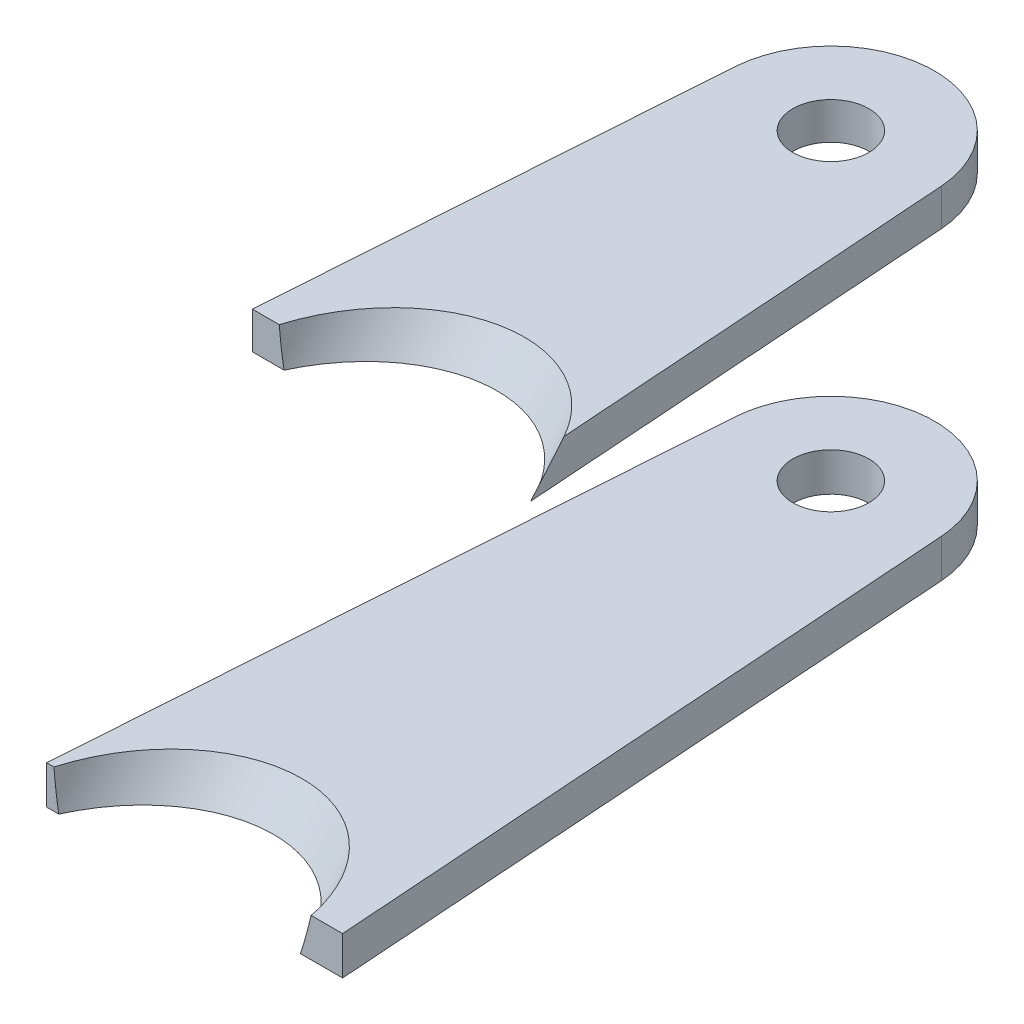
ISO-10303-21;
HEADER;
FILE_DESCRIPTION(('STEP AP214'),'2;1');
FILE_NAME('part.step','',(''),(''),'','','');
FILE_SCHEMA(('AUTOMOTIVE_DESIGN { 1 0 10303 214 1 1 1 1 }'));
ENDSEC;
DATA;
#1=APPLICATION_CONTEXT('core data for automotive mechanical design processes');
#2=APPLICATION_PROTOCOL_DEFINITION('international standard','automotive_design',2000,#1);
#3=PRODUCT_CONTEXT('',#1,'mechanical');
#4=PRODUCT('Part','Part','',(#3));
#5=PRODUCT_RELATED_PRODUCT_CATEGORY('part','',(#4));
#6=PRODUCT_DEFINITION_FORMATION('','',#4);
#7=PRODUCT_DEFINITION_CONTEXT('part definition',#1,'design');
#8=PRODUCT_DEFINITION('design','',#6,#7);
#9=PRODUCT_DEFINITION_SHAPE('','',#8);
#10=(LENGTH_UNIT() NAMED_UNIT(*) SI_UNIT(.MILLI.,.METRE.));
#11=(NAMED_UNIT(*) PLANE_ANGLE_UNIT() SI_UNIT($,.RADIAN.));
#12=(NAMED_UNIT(*) SI_UNIT($,.STERADIAN.) SOLID_ANGLE_UNIT());
#13=UNCERTAINTY_MEASURE_WITH_UNIT(LENGTH_MEASURE(1.E-05),#10,'distance_accuracy_value','');
#14=(GEOMETRIC_REPRESENTATION_CONTEXT(3) GLOBAL_UNCERTAINTY_ASSIGNED_CONTEXT((#13)) GLOBAL_UNIT_ASSIGNED_CONTEXT((#10,
#11,#12)) REPRESENTATION_CONTEXT('',''));
#15=CARTESIAN_POINT('',(0.,0.,0.));
#16=DIRECTION('',(0.,0.,1.));
#17=DIRECTION('',(1.,0.,0.));
#18=AXIS2_PLACEMENT_3D('',#15,#16,#17);
#19=CARTESIAN_POINT('',(-8.86868290993993,14.605,-0.615275095334869));
#20=DIRECTION('',(-0.997602127102355,0.,-0.0692097970005477));
#21=DIRECTION('',(0.0692097970005477,0.,-0.997602127102355));
#22=AXIS2_PLACEMENT_3D('',#19,#20,#21);
#23=PLANE('',#22);
#24=DIRECTION('',(-0.0692097970005477,0.,0.997602127102355));
#25=VECTOR('',#24,1.);
#26=CARTESIAN_POINT('',(-8.86868290993993,11.43,-0.615275095334869));
#27=LINE('',#26,#25);
#28=CARTESIAN_POINT('',(-8.86868290993993,11.43,-0.615275095334868));
#29=VERTEX_POINT('',#28);
#30=CARTESIAN_POINT('',(-11.55459972725,11.43,38.1));
#31=VERTEX_POINT('',#30);
#32=EDGE_CURVE('E118',#29,#31,#27,.T.);
#33=ORIENTED_EDGE('',*,*,#32,.T.);
#34=DIRECTION('',(0.,-1.,0.));
#35=VECTOR('',#34,1.);
#36=CARTESIAN_POINT('',(-11.55459972725,14.605,38.1));
#37=LINE('',#36,#35);
#38=CARTESIAN_POINT('',(-11.55459972725,14.605,38.1));
#39=VERTEX_POINT('',#38);
#40=EDGE_CURVE('E115',#39,#31,#37,.T.);
#41=ORIENTED_EDGE('',*,*,#40,.F.);
#42=DIRECTION('',(-0.0692097970005477,0.,0.997602127102355));
#43=VECTOR('',#42,1.);
#44=CARTESIAN_POINT('',(-8.86868290993993,14.605,-0.615275095334869));
#45=LINE('',#44,#43);
#46=CARTESIAN_POINT('',(-8.86868290993993,14.605,-0.615275095334868));
#47=VERTEX_POINT('',#46);
#48=EDGE_CURVE('E135',#47,#39,#45,.T.);
#49=ORIENTED_EDGE('',*,*,#48,.F.);
#50=DIRECTION('',(0.,-1.,0.));
#51=VECTOR('',#50,1.);
#52=CARTESIAN_POINT('',(-8.86868290993993,14.605,-0.615275095334868));
#53=LINE('',#52,#51);
#54=EDGE_CURVE('E141',#47,#29,#53,.T.);
#55=ORIENTED_EDGE('',*,*,#54,.T.);
#56=EDGE_LOOP('',(#33,#41,#49,#55));
#57=FACE_BOUND('',#56,.T.);
#58=ADVANCED_FACE('F53',(#57),#23,.T.);
#59=CARTESIAN_POINT('',(0.,14.605,0.));
#60=DIRECTION('',(0.,-1.,0.));
#61=DIRECTION('',(0.,0.,1.));
#62=AXIS2_PLACEMENT_3D('',#59,#60,#61);
#63=CYLINDRICAL_SURFACE('',#62,8.89);
#64=CARTESIAN_POINT('',(0.,11.43,0.));
#65=DIRECTION('',(0.,-1.,0.));
#66=DIRECTION('',(0.,0.,-1.));
#67=AXIS2_PLACEMENT_3D('',#64,#65,#66);
#68=CIRCLE('',#67,8.89);
#69=CARTESIAN_POINT('',(8.86868290993993,11.43,-0.615275095334868));
#70=VERTEX_POINT('',#69);
#71=EDGE_CURVE('E129',#29,#70,#68,.T.);
#72=ORIENTED_EDGE('',*,*,#71,.F.);
#73=ORIENTED_EDGE('',*,*,#54,.F.);
#74=CARTESIAN_POINT('',(0.,14.605,0.));
#75=DIRECTION('',(0.,-1.,0.));
#76=DIRECTION('',(0.,0.,-1.));
#77=AXIS2_PLACEMENT_3D('',#74,#75,#76);
#78=CIRCLE('',#77,8.89);
#79=CARTESIAN_POINT('',(8.86868290993993,14.605,-0.615275095334868));
#80=VERTEX_POINT('',#79);
#81=EDGE_CURVE('E121',#47,#80,#78,.T.);
#82=ORIENTED_EDGE('',*,*,#81,.T.);
#83=DIRECTION('',(0.,-1.,0.));
#84=VECTOR('',#83,1.);
#85=CARTESIAN_POINT('',(8.86868290993993,14.605,-0.615275095334868));
#86=LINE('',#85,#84);
#87=EDGE_CURVE('E139',#80,#70,#86,.T.);
#88=ORIENTED_EDGE('',*,*,#87,.T.);
#89=EDGE_LOOP('',(#72,#73,#82,#88));
#90=FACE_BOUND('',#89,.T.);
#91=ADVANCED_FACE('F148',(#90),#63,.T.);
#92=CARTESIAN_POINT('',(8.86868290993993,14.605,-0.615275095334869));
#93=DIRECTION('',(-0.997602127102355,0.,0.0692097970005477));
#94=DIRECTION('',(-0.0692097970005477,0.,-0.997602127102355));
#95=AXIS2_PLACEMENT_3D('',#92,#93,#94);
#96=PLANE('',#95);
#97=CARTESIAN_POINT('',(8.84283889499851,83.1664793631328,-0.987795249934129));
#98=DIRECTION('',(0.997602127102355,0.,-0.0692097970005477));
#99=DIRECTION('',(0.0363868695531692,-0.850640753053232,0.524486706189157));
#100=AXIS2_PLACEMENT_3D('',#97,#98,#99);
#101=ELLIPSE('',#100,90.6261498335669,11.43);
#102=CARTESIAN_POINT('',(11.2828227595914,14.605,34.1825592216163));
#103=VERTEX_POINT('',#102);
#104=CARTESIAN_POINT('',(11.4983302677009,11.43,37.2889221617482));
#105=VERTEX_POINT('',#104);
#106=EDGE_CURVE('E63',#103,#105,#101,.F.);
#107=ORIENTED_EDGE('',*,*,#106,.T.);
#108=DIRECTION('',(0.0692097970005477,0.,0.997602127102355));
#109=VECTOR('',#108,1.);
#110=CARTESIAN_POINT('',(8.86868290993993,11.43,-0.615275095334869));
#111=LINE('',#110,#109);
#112=EDGE_CURVE('E105',#70,#105,#111,.T.);
#113=ORIENTED_EDGE('',*,*,#112,.F.);
#114=ORIENTED_EDGE('',*,*,#87,.F.);
#115=DIRECTION('',(0.0692097970005477,0.,0.997602127102355));
#116=VECTOR('',#115,1.);
#117=CARTESIAN_POINT('',(8.86868290993993,14.605,-0.615275095334869));
#118=LINE('',#117,#116);
#119=EDGE_CURVE('E133',#80,#103,#118,.T.);
#120=ORIENTED_EDGE('',*,*,#119,.T.);
#121=EDGE_LOOP('',(#107,#113,#114,#120));
#122=FACE_BOUND('',#121,.T.);
#123=ADVANCED_FACE('F151',(#122),#96,.F.);
#124=CARTESIAN_POINT('',(0.,14.605,38.1));
#125=DIRECTION('',(0.,0.,1.));
#126=DIRECTION('',(-1.,0.,0.));
#127=AXIS2_PLACEMENT_3D('',#124,#125,#126);
#128=PLANE('',#127);
#129=DIRECTION('',(1.,0.,0.));
#130=VECTOR('',#129,1.);
#131=CARTESIAN_POINT('',(0.,14.605,38.1));
#132=LINE('',#131,#130);
#133=CARTESIAN_POINT('',(-9.24827472327813,14.605,38.1));
#134=VERTEX_POINT('',#133);
#135=EDGE_CURVE('E112',#39,#134,#132,.T.);
#136=ORIENTED_EDGE('',*,*,#135,.F.);
#137=ORIENTED_EDGE('',*,*,#40,.T.);
#138=DIRECTION('',(1.,0.,0.));
#139=VECTOR('',#138,1.);
#140=CARTESIAN_POINT('',(0.,11.43,38.1));
#141=LINE('',#140,#139);
#142=CARTESIAN_POINT('',(-8.82962589414889,11.43,38.1));
#143=VERTEX_POINT('',#142);
#144=EDGE_CURVE('E57',#31,#143,#141,.T.);
#145=ORIENTED_EDGE('',*,*,#144,.T.);
#146=CARTESIAN_POINT('',(2.21349320391462,20.81779833939,38.1));
#147=DIRECTION('',(0.,0.,-1.));
#148=DIRECTION('',(-0.105730972730061,-0.994394771408999,0.));
#149=AXIS2_PLACEMENT_3D('',#146,#147,#148);
#150=ELLIPSE('',#149,21.6056853103098,11.43);
#151=EDGE_CURVE('E108',#134,#143,#150,.F.);
#152=ORIENTED_EDGE('',*,*,#151,.F.);
#153=EDGE_LOOP('',(#136,#137,#145,#152));
#154=FACE_BOUND('',#153,.T.);
#155=ADVANCED_FACE('F55',(#154),#128,.T.);
#156=CARTESIAN_POINT('',(0.,14.605,0.));
#157=DIRECTION('',(0.,-1.,0.));
#158=DIRECTION('',(0.,0.,1.));
#159=AXIS2_PLACEMENT_3D('',#156,#157,#158);
#160=CYLINDRICAL_SURFACE('',#159,3.2639);
#161=CARTESIAN_POINT('',(0.,14.605,0.));
#162=DIRECTION('',(0.,-1.,0.));
#163=DIRECTION('',(0.,0.,-1.));
#164=AXIS2_PLACEMENT_3D('',#161,#162,#163);
#165=CIRCLE('',#164,3.2639);
#166=CARTESIAN_POINT('',(0.,14.605,-3.2639));
#167=VERTEX_POINT('',#166);
#168=EDGE_CURVE('E111',#167,#167,#165,.T.);
#169=ORIENTED_EDGE('',*,*,#168,.F.);
#170=EDGE_LOOP('',(#169));
#171=FACE_BOUND('',#170,.T.);
#172=CARTESIAN_POINT('',(0.,11.43,0.));
#173=DIRECTION('',(0.,-1.,0.));
#174=DIRECTION('',(0.,0.,-1.));
#175=AXIS2_PLACEMENT_3D('',#172,#173,#174);
#176=CIRCLE('',#175,3.2639);
#177=CARTESIAN_POINT('',(0.,11.43,-3.2639));
#178=VERTEX_POINT('',#177);
#179=EDGE_CURVE('E117',#178,#178,#176,.T.);
#180=ORIENTED_EDGE('',*,*,#179,.T.);
#181=EDGE_LOOP('',(#180));
#182=FACE_BOUND('',#181,.T.);
#183=ADVANCED_FACE('F163',(#171,#182),#160,.F.);
#184=CARTESIAN_POINT('',(0.,14.605,0.));
#185=DIRECTION('',(0.,1.,0.));
#186=DIRECTION('',(0.,0.,-1.));
#187=AXIS2_PLACEMENT_3D('',#184,#185,#186);
#188=PLANE('',#187);
#189=ORIENTED_EDGE('',*,*,#119,.F.);
#190=ORIENTED_EDGE('',*,*,#81,.F.);
#191=ORIENTED_EDGE('',*,*,#48,.T.);
#192=ORIENTED_EDGE('',*,*,#135,.T.);
#193=CARTESIAN_POINT('',(1.55290524560441,14.605,41.9949434924972));
#194=DIRECTION('',(0.,-1.,0.));
#195=DIRECTION('',(-0.167213553621578,0.,0.985920700404066));
#196=AXIS2_PLACEMENT_3D('',#193,#194,#195);
#197=ELLIPSE('',#196,13.5450917289221,11.43);
#198=EDGE_CURVE('E72',#103,#134,#197,.F.);
#199=ORIENTED_EDGE('',*,*,#198,.F.);
#200=EDGE_LOOP('',(#189,#190,#191,#192,#199));
#201=FACE_BOUND('',#200,.T.);
#202=ORIENTED_EDGE('',*,*,#168,.T.);
#203=EDGE_LOOP('',(#202));
#204=FACE_BOUND('',#203,.T.);
#205=ADVANCED_FACE('F152',(#201,#204),#188,.T.);
#206=CARTESIAN_POINT('',(0.,11.43,0.));
#207=DIRECTION('',(0.,1.,0.));
#208=DIRECTION('',(0.,0.,-1.));
#209=AXIS2_PLACEMENT_3D('',#206,#207,#208);
#210=PLANE('',#209);
#211=CARTESIAN_POINT('',(1.21531714873391,11.43,43.9854226474817));
#212=DIRECTION('',(0.,-1.,0.));
#213=DIRECTION('',(-0.167213553621578,0.,0.985920700404066));
#214=AXIS2_PLACEMENT_3D('',#211,#212,#213);
#215=ELLIPSE('',#214,13.5450917289221,11.43);
#216=EDGE_CURVE('E12',#105,#143,#215,.F.);
#217=ORIENTED_EDGE('',*,*,#216,.T.);
#218=ORIENTED_EDGE('',*,*,#144,.F.);
#219=ORIENTED_EDGE('',*,*,#32,.F.);
#220=ORIENTED_EDGE('',*,*,#71,.T.);
#221=ORIENTED_EDGE('',*,*,#112,.T.);
#222=EDGE_LOOP('',(#217,#218,#219,#220,#221));
#223=FACE_BOUND('',#222,.T.);
#224=ORIENTED_EDGE('',*,*,#179,.F.);
#225=EDGE_LOOP('',(#224));
#226=FACE_BOUND('',#225,.T.);
#227=ADVANCED_FACE('F99',(#223,#226),#210,.F.);
#228=CARTESIAN_POINT('',(2.58917582267937,24.3510755065516,35.8849088031439));
#229=DIRECTION('',(-0.0897238035043212,-0.84384810592269,0.529027421988129));
#230=DIRECTION('',(0.0559345839276817,0.526062102356978,0.848604729414463));
#231=AXIS2_PLACEMENT_3D('',#228,#229,#230);
#232=CYLINDRICAL_SURFACE('',#231,11.43);
#233=ORIENTED_EDGE('',*,*,#106,.F.);
#234=ORIENTED_EDGE('',*,*,#198,.T.);
#235=ORIENTED_EDGE('',*,*,#151,.T.);
#236=ORIENTED_EDGE('',*,*,#216,.F.);
#237=EDGE_LOOP('',(#233,#234,#235,#236));
#238=FACE_BOUND('',#237,.T.);
#239=ADVANCED_FACE('F109',(#238),#232,.F.);
#240=CLOSED_SHELL('',(#58,#91,#123,#155,#183,#205,#227,#239));
#241=MANIFOLD_SOLID_BREP('B2',#240);
#242=CARTESIAN_POINT('',(0.,-14.732,54.61));
#243=DIRECTION('',(0.,0.,1.));
#244=DIRECTION('',(-1.,0.,0.));
#245=AXIS2_PLACEMENT_3D('',#242,#243,#244);
#246=PLANE('',#245);
#247=DIRECTION('',(-1.,0.,0.));
#248=VECTOR('',#247,1.);
#249=CARTESIAN_POINT('',(0.,-14.732,54.61));
#250=LINE('',#249,#248);
#251=CARTESIAN_POINT('',(12.7,-14.732,54.61));
#252=VERTEX_POINT('',#251);
#253=CARTESIAN_POINT('',(9.08082222906851,-14.732,54.61));
#254=VERTEX_POINT('',#253);
#255=EDGE_CURVE('E325',#252,#254,#250,.T.);
#256=ORIENTED_EDGE('',*,*,#255,.F.);
#257=DIRECTION('',(0.,1.,0.));
#258=VECTOR('',#257,1.);
#259=CARTESIAN_POINT('',(12.7,-14.732,54.61));
#260=LINE('',#259,#258);
#261=CARTESIAN_POINT('',(12.7,-11.43,54.61));
#262=VERTEX_POINT('',#261);
#263=EDGE_CURVE('E312',#252,#262,#260,.T.);
#264=ORIENTED_EDGE('',*,*,#263,.T.);
#265=DIRECTION('',(-1.,0.,0.));
#266=VECTOR('',#265,1.);
#267=CARTESIAN_POINT('',(0.,-11.43,54.61));
#268=LINE('',#267,#266);
#269=CARTESIAN_POINT('',(9.99660348571723,-11.43,54.61));
#270=VERTEX_POINT('',#269);
#271=EDGE_CURVE('E234',#262,#270,#268,.T.);
#272=ORIENTED_EDGE('',*,*,#271,.T.);
#273=CARTESIAN_POINT('',(-0.586626287603124,-5.51719234299509,54.61));
#274=DIRECTION('',(0.,0.,-1.));
#275=DIRECTION('',(-0.105730972730061,-0.994394771408999,0.));
#276=AXIS2_PLACEMENT_3D('',#273,#274,#275);
#277=ELLIPSE('',#276,21.6056853103098,11.43);
#278=EDGE_CURVE('E324',#254,#270,#277,.F.);
#279=ORIENTED_EDGE('',*,*,#278,.F.);
#280=EDGE_LOOP('',(#256,#264,#272,#279));
#281=FACE_BOUND('',#280,.T.);
#282=ADVANCED_FACE('F230',(#281),#246,.T.);
#283=CARTESIAN_POINT('',(-8.86868290993993,-14.732,-0.615275095334869));
#284=DIRECTION('',(0.997602127102355,0.,0.0692097970005477));
#285=DIRECTION('',(-0.0692097970005477,0.,0.997602127102355));
#286=AXIS2_PLACEMENT_3D('',#283,#284,#285);
#287=PLANE('',#286);
#288=DIRECTION('',(-0.0692097970005477,0.,0.997602127102355));
#289=VECTOR('',#288,1.);
#290=CARTESIAN_POINT('',(-8.86868290993993,-11.43,-0.615275095334869));
#291=LINE('',#290,#289);
#292=CARTESIAN_POINT('',(-8.86868290993993,-11.43,-0.615275095334868));
#293=VERTEX_POINT('',#292);
#294=CARTESIAN_POINT('',(-12.7,-11.43,54.61));
#295=VERTEX_POINT('',#294);
#296=EDGE_CURVE('E326',#293,#295,#291,.T.);
#297=ORIENTED_EDGE('',*,*,#296,.F.);
#298=DIRECTION('',(0.,1.,0.));
#299=VECTOR('',#298,1.);
#300=CARTESIAN_POINT('',(-8.86868290993993,-14.732,-0.615275095334868));
#301=LINE('',#300,#299);
#302=CARTESIAN_POINT('',(-8.86868290993993,-14.732,-0.615275095334868));
#303=VERTEX_POINT('',#302);
#304=EDGE_CURVE('E323',#303,#293,#301,.T.);
#305=ORIENTED_EDGE('',*,*,#304,.F.);
#306=DIRECTION('',(-0.0692097970005477,0.,0.997602127102355));
#307=VECTOR('',#306,1.);
#308=CARTESIAN_POINT('',(-8.86868290993993,-14.732,-0.615275095334869));
#309=LINE('',#308,#307);
#310=CARTESIAN_POINT('',(-12.7,-14.732,54.61));
#311=VERTEX_POINT('',#310);
#312=EDGE_CURVE('E304',#303,#311,#309,.T.);
#313=ORIENTED_EDGE('',*,*,#312,.T.);
#314=DIRECTION('',(0.,1.,0.));
#315=VECTOR('',#314,1.);
#316=CARTESIAN_POINT('',(-12.7,-14.732,54.61));
#317=LINE('',#316,#315);
#318=EDGE_CURVE('E314',#311,#295,#317,.T.);
#319=ORIENTED_EDGE('',*,*,#318,.T.);
#320=EDGE_LOOP('',(#297,#305,#313,#319));
#321=FACE_BOUND('',#320,.T.);
#322=ADVANCED_FACE('F330',(#321),#287,.F.);
#323=CARTESIAN_POINT('',(-12.0724784029093,-11.43,54.61));
#324=VERTEX_POINT('',#323);
#325=EDGE_CURVE('E293',#324,#295,#268,.T.);
#326=ORIENTED_EDGE('',*,*,#325,.T.);
#327=ORIENTED_EDGE('',*,*,#318,.F.);
#328=CARTESIAN_POINT('',(-11.6607654579883,-14.732,54.61));
#329=VERTEX_POINT('',#328);
#330=EDGE_CURVE('E317',#329,#311,#250,.T.);
#331=ORIENTED_EDGE('',*,*,#330,.F.);
#332=EDGE_CURVE('E322',#324,#329,#277,.F.);
#333=ORIENTED_EDGE('',*,*,#332,.F.);
#334=EDGE_LOOP('',(#326,#327,#331,#333));
#335=FACE_BOUND('',#334,.T.);
#336=ADVANCED_FACE('F232',(#335),#246,.T.);
#337=CARTESIAN_POINT('',(8.86868290993993,-14.732,-0.615275095334869));
#338=DIRECTION('',(0.997602127102355,0.,-0.0692097970005477));
#339=DIRECTION('',(0.0692097970005477,0.,0.997602127102355));
#340=AXIS2_PLACEMENT_3D('',#337,#338,#339);
#341=PLANE('',#340);
#342=DIRECTION('',(0.0692097970005477,0.,0.997602127102355));
#343=VECTOR('',#342,1.);
#344=CARTESIAN_POINT('',(8.86868290993993,-11.43,-0.615275095334869));
#345=LINE('',#344,#343);
#346=CARTESIAN_POINT('',(8.86868290993993,-11.43,-0.615275095334868));
#347=VERTEX_POINT('',#346);
#348=EDGE_CURVE('E297',#347,#262,#345,.T.);
#349=ORIENTED_EDGE('',*,*,#348,.T.);
#350=ORIENTED_EDGE('',*,*,#263,.F.);
#351=DIRECTION('',(0.0692097970005477,0.,0.997602127102355));
#352=VECTOR('',#351,1.);
#353=CARTESIAN_POINT('',(8.86868290993993,-14.732,-0.615275095334869));
#354=LINE('',#353,#352);
#355=CARTESIAN_POINT('',(8.86868290993993,-14.732,-0.615275095334868));
#356=VERTEX_POINT('',#355);
#357=EDGE_CURVE('E282',#356,#252,#354,.T.);
#358=ORIENTED_EDGE('',*,*,#357,.F.);
#359=DIRECTION('',(0.,1.,0.));
#360=VECTOR('',#359,1.);
#361=CARTESIAN_POINT('',(8.86868290993993,-14.732,-0.615275095334868));
#362=LINE('',#361,#360);
#363=EDGE_CURVE('E306',#356,#347,#362,.T.);
#364=ORIENTED_EDGE('',*,*,#363,.T.);
#365=EDGE_LOOP('',(#349,#350,#358,#364));
#366=FACE_BOUND('',#365,.T.);
#367=ADVANCED_FACE('F310',(#366),#341,.T.);
#368=CARTESIAN_POINT('',(0.,-14.732,0.));
#369=DIRECTION('',(0.,1.,0.));
#370=DIRECTION('',(0.,0.,-1.));
#371=AXIS2_PLACEMENT_3D('',#368,#369,#370);
#372=PLANE('',#371);
#373=CARTESIAN_POINT('',(-1.56640876947904,-14.732,60.3869708845544));
#374=DIRECTION('',(0.,-1.,0.));
#375=DIRECTION('',(-0.167213553621578,0.,0.985920700404066));
#376=AXIS2_PLACEMENT_3D('',#373,#374,#375);
#377=ELLIPSE('',#376,13.5450917289221,11.43);
#378=EDGE_CURVE('E51',#254,#329,#377,.F.);
#379=ORIENTED_EDGE('',*,*,#378,.T.);
#380=ORIENTED_EDGE('',*,*,#330,.T.);
#381=ORIENTED_EDGE('',*,*,#312,.F.);
#382=CARTESIAN_POINT('',(0.,-14.732,0.));
#383=DIRECTION('',(0.,-1.,0.));
#384=DIRECTION('',(0.,0.,-1.));
#385=AXIS2_PLACEMENT_3D('',#382,#383,#384);
#386=CIRCLE('',#385,8.89);
#387=EDGE_CURVE('E300',#303,#356,#386,.T.);
#388=ORIENTED_EDGE('',*,*,#387,.T.);
#389=ORIENTED_EDGE('',*,*,#357,.T.);
#390=ORIENTED_EDGE('',*,*,#255,.T.);
#391=EDGE_LOOP('',(#379,#380,#381,#388,#389,#390));
#392=FACE_BOUND('',#391,.T.);
#393=CARTESIAN_POINT('',(0.,-14.732,0.));
#394=DIRECTION('',(0.,-1.,0.));
#395=DIRECTION('',(0.,0.,-1.));
#396=AXIS2_PLACEMENT_3D('',#393,#394,#395);
#397=CIRCLE('',#396,3.2639);
#398=CARTESIAN_POINT('',(0.,-14.732,-3.2639));
#399=VERTEX_POINT('',#398);
#400=EDGE_CURVE('E331',#399,#399,#397,.T.);
#401=ORIENTED_EDGE('',*,*,#400,.F.);
#402=EDGE_LOOP('',(#401));
#403=FACE_BOUND('',#402,.T.);
#404=ADVANCED_FACE('F301',(#392,#403),#372,.F.);
#405=CARTESIAN_POINT('',(0.,-11.43,0.));
#406=DIRECTION('',(0.,1.,0.));
#407=DIRECTION('',(0.,0.,-1.));
#408=AXIS2_PLACEMENT_3D('',#405,#406,#407);
#409=PLANE('',#408);
#410=ORIENTED_EDGE('',*,*,#271,.F.);
#411=ORIENTED_EDGE('',*,*,#348,.F.);
#412=CARTESIAN_POINT('',(0.,-11.43,0.));
#413=DIRECTION('',(0.,-1.,0.));
#414=DIRECTION('',(0.,0.,-1.));
#415=AXIS2_PLACEMENT_3D('',#412,#413,#414);
#416=CIRCLE('',#415,8.89);
#417=EDGE_CURVE('E267',#293,#347,#416,.T.);
#418=ORIENTED_EDGE('',*,*,#417,.F.);
#419=ORIENTED_EDGE('',*,*,#296,.T.);
#420=ORIENTED_EDGE('',*,*,#325,.F.);
#421=CARTESIAN_POINT('',(-1.21531714873371,-11.43,58.3168725633705));
#422=DIRECTION('',(0.,-1.,0.));
#423=DIRECTION('',(-0.167213553621578,0.,0.985920700404066));
#424=AXIS2_PLACEMENT_3D('',#421,#422,#423);
#425=ELLIPSE('',#424,13.5450917289221,11.43);
#426=EDGE_CURVE('E337',#270,#324,#425,.F.);
#427=ORIENTED_EDGE('',*,*,#426,.F.);
#428=EDGE_LOOP('',(#410,#411,#418,#419,#420,#427));
#429=FACE_BOUND('',#428,.T.);
#430=CARTESIAN_POINT('',(0.,-11.43,0.));
#431=DIRECTION('',(0.,-1.,0.));
#432=DIRECTION('',(0.,0.,-1.));
#433=AXIS2_PLACEMENT_3D('',#430,#431,#432);
#434=CIRCLE('',#433,3.2639);
#435=CARTESIAN_POINT('',(0.,-11.43,-3.2639));
#436=VERTEX_POINT('',#435);
#437=EDGE_CURVE('E240',#436,#436,#434,.T.);
#438=ORIENTED_EDGE('',*,*,#437,.T.);
#439=EDGE_LOOP('',(#438));
#440=FACE_BOUND('',#439,.T.);
#441=ADVANCED_FACE('F344',(#429,#440),#409,.T.);
#442=CARTESIAN_POINT('',(0.,-14.732,0.));
#443=DIRECTION('',(0.,1.,0.));
#444=DIRECTION('',(0.,0.,-1.));
#445=AXIS2_PLACEMENT_3D('',#442,#443,#444);
#446=CYLINDRICAL_SURFACE('',#445,8.89);
#447=ORIENTED_EDGE('',*,*,#304,.T.);
#448=ORIENTED_EDGE('',*,*,#417,.T.);
#449=ORIENTED_EDGE('',*,*,#363,.F.);
#450=ORIENTED_EDGE('',*,*,#387,.F.);
#451=EDGE_LOOP('',(#447,#448,#449,#450));
#452=FACE_BOUND('',#451,.T.);
#453=ADVANCED_FACE('F308',(#452),#446,.T.);
#454=CARTESIAN_POINT('',(0.,-14.732,0.));
#455=DIRECTION('',(0.,1.,0.));
#456=DIRECTION('',(0.,0.,-1.));
#457=AXIS2_PLACEMENT_3D('',#454,#455,#456);
#458=CYLINDRICAL_SURFACE('',#457,3.2639);
#459=CARTESIAN_POINT('',(0.,-14.732,-3.2639));
#460=CARTESIAN_POINT('',(0.,-14.6976041666667,-3.2639));
#461=CARTESIAN_POINT('',(0.,-14.6632083333333,-3.2639));
#462=CARTESIAN_POINT('',(0.,-14.5944166666667,-3.2639));
#463=CARTESIAN_POINT('',(0.,-14.5600208333333,-3.2639));
#464=CARTESIAN_POINT('',(0.,-14.4912291666667,-3.2639));
#465=CARTESIAN_POINT('',(0.,-14.4568333333333,-3.2639));
#466=CARTESIAN_POINT('',(0.,-14.3880416666667,-3.2639));
#467=CARTESIAN_POINT('',(0.,-14.3536458333333,-3.2639));
#468=CARTESIAN_POINT('',(0.,-14.2848541666667,-3.2639));
#469=CARTESIAN_POINT('',(0.,-14.2504583333333,-3.2639));
#470=CARTESIAN_POINT('',(0.,-14.1816666666667,-3.2639));
#471=CARTESIAN_POINT('',(0.,-14.1472708333333,-3.2639));
#472=CARTESIAN_POINT('',(0.,-14.0784791666667,-3.2639));
#473=CARTESIAN_POINT('',(0.,-14.0440833333333,-3.2639));
#474=CARTESIAN_POINT('',(0.,-13.9752916666667,-3.2639));
#475=CARTESIAN_POINT('',(0.,-13.9408958333333,-3.2639));
#476=CARTESIAN_POINT('',(0.,-13.8721041666667,-3.2639));
#477=CARTESIAN_POINT('',(0.,-13.8377083333333,-3.2639));
#478=CARTESIAN_POINT('',(0.,-13.7689166666667,-3.2639));
#479=CARTESIAN_POINT('',(0.,-13.7345208333333,-3.2639));
#480=CARTESIAN_POINT('',(0.,-13.6657291666667,-3.2639));
#481=CARTESIAN_POINT('',(0.,-13.6313333333333,-3.2639));
#482=CARTESIAN_POINT('',(0.,-13.5625416666667,-3.2639));
#483=CARTESIAN_POINT('',(0.,-13.5281458333333,-3.2639));
#484=CARTESIAN_POINT('',(0.,-13.4593541666667,-3.2639));
#485=CARTESIAN_POINT('',(0.,-13.4249583333333,-3.2639));
#486=CARTESIAN_POINT('',(0.,-13.3561666666667,-3.2639));
#487=CARTESIAN_POINT('',(0.,-13.3217708333333,-3.2639));
#488=CARTESIAN_POINT('',(0.,-13.2529791666667,-3.2639));
#489=CARTESIAN_POINT('',(0.,-13.2185833333333,-3.2639));
#490=CARTESIAN_POINT('',(0.,-13.1497916666667,-3.2639));
#491=CARTESIAN_POINT('',(0.,-13.1153958333333,-3.2639));
#492=CARTESIAN_POINT('',(0.,-13.0466041666667,-3.2639));
#493=CARTESIAN_POINT('',(0.,-13.0122083333333,-3.2639));
#494=CARTESIAN_POINT('',(0.,-12.9434166666667,-3.2639));
#495=CARTESIAN_POINT('',(0.,-12.9090208333333,-3.2639));
#496=CARTESIAN_POINT('',(0.,-12.8402291666667,-3.2639));
#497=CARTESIAN_POINT('',(0.,-12.8058333333333,-3.2639));
#498=CARTESIAN_POINT('',(0.,-12.7370416666667,-3.2639));
#499=CARTESIAN_POINT('',(0.,-12.7026458333333,-3.2639));
#500=CARTESIAN_POINT('',(0.,-12.6338541666667,-3.2639));
#501=CARTESIAN_POINT('',(0.,-12.5994583333333,-3.2639));
#502=CARTESIAN_POINT('',(0.,-12.5306666666667,-3.2639));
#503=CARTESIAN_POINT('',(0.,-12.4962708333333,-3.2639));
#504=CARTESIAN_POINT('',(0.,-12.4274791666667,-3.2639));
#505=CARTESIAN_POINT('',(0.,-12.3930833333333,-3.2639));
#506=CARTESIAN_POINT('',(0.,-12.3242916666667,-3.2639));
#507=CARTESIAN_POINT('',(0.,-12.2898958333333,-3.2639));
#508=CARTESIAN_POINT('',(0.,-12.2211041666667,-3.2639));
#509=CARTESIAN_POINT('',(0.,-12.1867083333333,-3.2639));
#510=CARTESIAN_POINT('',(0.,-12.1179166666667,-3.2639));
#511=CARTESIAN_POINT('',(0.,-12.0835208333333,-3.2639));
#512=CARTESIAN_POINT('',(0.,-12.0147291666667,-3.2639));
#513=CARTESIAN_POINT('',(0.,-11.9803333333333,-3.2639));
#514=CARTESIAN_POINT('',(0.,-11.9115416666667,-3.2639));
#515=CARTESIAN_POINT('',(0.,-11.8771458333333,-3.2639));
#516=CARTESIAN_POINT('',(0.,-11.8083541666667,-3.2639));
#517=CARTESIAN_POINT('',(0.,-11.7739583333333,-3.2639));
#518=CARTESIAN_POINT('',(0.,-11.7051666666667,-3.2639));
#519=CARTESIAN_POINT('',(0.,-11.6707708333333,-3.2639));
#520=CARTESIAN_POINT('',(0.,-11.6019791666667,-3.2639));
#521=CARTESIAN_POINT('',(0.,-11.5675833333333,-3.2639));
#522=CARTESIAN_POINT('',(0.,-11.4987916666667,-3.2639));
#523=CARTESIAN_POINT('',(0.,-11.4643958333333,-3.2639));
#524=CARTESIAN_POINT('',(0.,-11.43,-3.2639));
#525=B_SPLINE_CURVE_WITH_KNOTS('',3,(#459,#460,#461,#462,#463,#464,#465,#466,#467,#468,#469,
#470,#471,#472,#473,#474,#475,#476,#477,#478,#479,#480,#481,#482,#483,#484,#485,#486,#487,#488,
#489,#490,#491,#492,#493,#494,#495,#496,#497,#498,#499,#500,#501,#502,#503,#504,#505,#506,#507,
#508,#509,#510,#511,#512,#513,#514,#515,#516,#517,#518,#519,#520,#521,#522,#523,#524),
.UNSPECIFIED.,.F.,.F.,(4,2,2,2,2,2,2,2,2,2,2,2,2,2,2,2,2,2,2,2,2,2,2,2,2,2,2,2,2,2,2,2,4),(0.,
0.103187499999999,0.206375,0.309562499999999,0.41275,0.515937499999999,0.619125,
0.722312499999999,0.8255,0.928687499999999,1.031875,1.1350625,1.23825,1.3414375,1.444625,
1.5478125,1.651,1.7541875,1.857375,1.9605625,2.06375,2.1669375,2.270125,2.3733125,2.4765,
2.5796875,2.682875,2.7860625,2.88925,2.9924375,3.095625,3.1988125,3.302),.UNSPECIFIED.);
#526=EDGE_CURVE('BSEAM351',#399,#436,#525,.T.);
#527=ORIENTED_EDGE('',*,*,#400,.T.);
#528=ORIENTED_EDGE('',*,*,#437,.F.);
#529=ORIENTED_EDGE('',*,*,#526,.T.);
#530=ORIENTED_EDGE('',*,*,#526,.F.);
#531=EDGE_LOOP('',(#527,#529,#528,#530));
#532=FACE_BOUND('',#531,.T.);
#533=ADVANCED_FACE('F351',(#532),#458,.F.);
#534=CARTESIAN_POINT('',(2.58917582267937,24.3510755065516,35.8849088031439));
#535=DIRECTION('',(-0.0897238035043212,-0.84384810592269,0.529027421988129));
#536=DIRECTION('',(0.0559345839276817,0.526062102356978,0.848604729414463));
#537=AXIS2_PLACEMENT_3D('',#534,#535,#536);
#538=CYLINDRICAL_SURFACE('',#537,11.43);
#539=ORIENTED_EDGE('',*,*,#378,.F.);
#540=ORIENTED_EDGE('',*,*,#278,.T.);
#541=ORIENTED_EDGE('',*,*,#426,.T.);
#542=ORIENTED_EDGE('',*,*,#332,.T.);
#543=EDGE_LOOP('',(#539,#540,#541,#542));
#544=FACE_BOUND('',#543,.T.);
#545=ADVANCED_FACE('F343',(#544),#538,.F.);
#546=CLOSED_SHELL('',(#282,#322,#336,#367,#404,#441,#453,#533,#545));
#547=MANIFOLD_SOLID_BREP('B6',#546);
#548=ADVANCED_BREP_SHAPE_REPRESENTATION('',(#18,#241,#547),#14);
#549=SHAPE_DEFINITION_REPRESENTATION(#9,#548);
ENDSEC;
END-ISO-10303-21;
